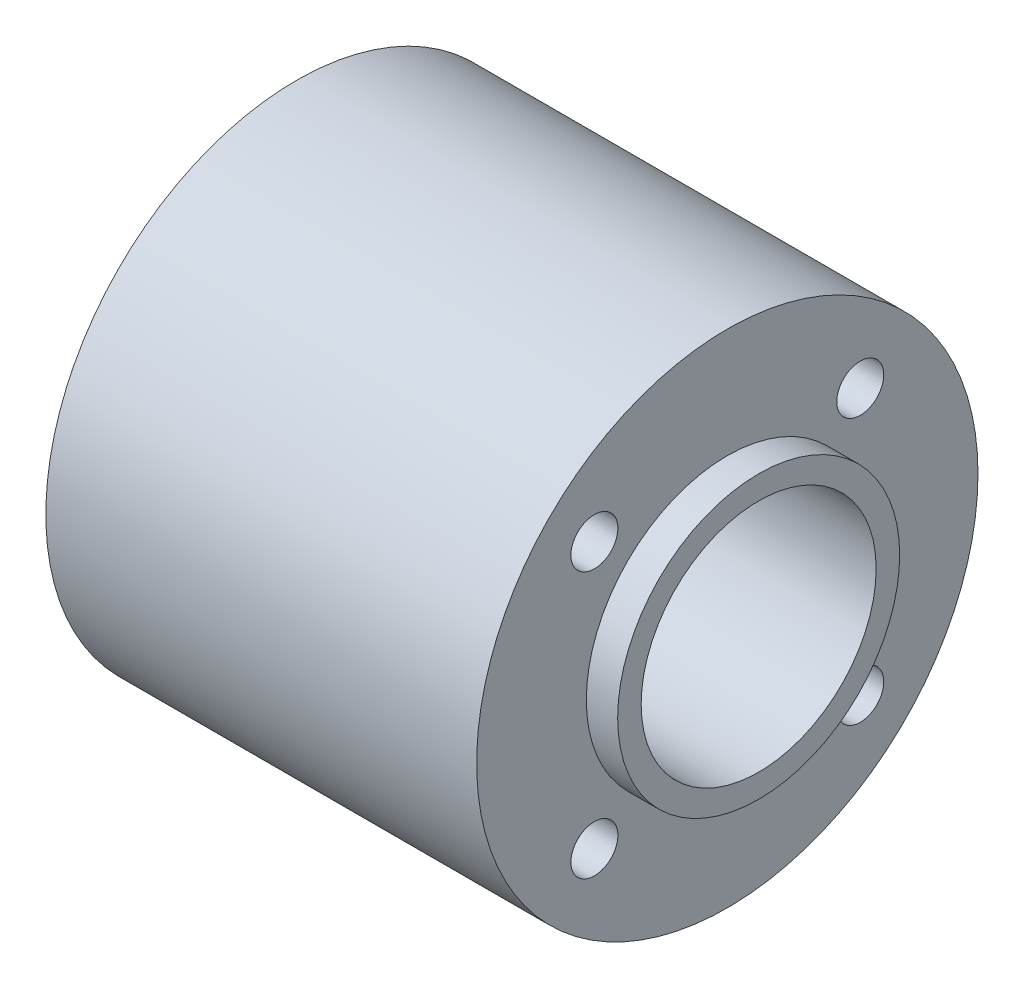
ISO-10303-21;
HEADER;
FILE_DESCRIPTION(('STEP AP214'),'2;1');
FILE_NAME('part.step','',(''),(''),'','','');
FILE_SCHEMA(('AUTOMOTIVE_DESIGN { 1 0 10303 214 1 1 1 1 }'));
ENDSEC;
DATA;
#1=APPLICATION_CONTEXT('core data for automotive mechanical design processes');
#2=APPLICATION_PROTOCOL_DEFINITION('international standard','automotive_design',2000,#1);
#3=PRODUCT_CONTEXT('',#1,'mechanical');
#4=PRODUCT('Part','Part','',(#3));
#5=PRODUCT_RELATED_PRODUCT_CATEGORY('part','',(#4));
#6=PRODUCT_DEFINITION_FORMATION('','',#4);
#7=PRODUCT_DEFINITION_CONTEXT('part definition',#1,'design');
#8=PRODUCT_DEFINITION('design','',#6,#7);
#9=PRODUCT_DEFINITION_SHAPE('','',#8);
#10=(LENGTH_UNIT() NAMED_UNIT(*) SI_UNIT(.MILLI.,.METRE.));
#11=(NAMED_UNIT(*) PLANE_ANGLE_UNIT() SI_UNIT($,.RADIAN.));
#12=(NAMED_UNIT(*) SI_UNIT($,.STERADIAN.) SOLID_ANGLE_UNIT());
#13=UNCERTAINTY_MEASURE_WITH_UNIT(LENGTH_MEASURE(1.E-05),#10,'distance_accuracy_value','');
#14=(GEOMETRIC_REPRESENTATION_CONTEXT(3) GLOBAL_UNCERTAINTY_ASSIGNED_CONTEXT((#13)) GLOBAL_UNIT_ASSIGNED_CONTEXT((#10,
#11,#12)) REPRESENTATION_CONTEXT('',''));
#15=CARTESIAN_POINT('',(0.,0.,0.));
#16=DIRECTION('',(0.,0.,1.));
#17=DIRECTION('',(1.,0.,0.));
#18=AXIS2_PLACEMENT_3D('',#15,#16,#17);
#19=CARTESIAN_POINT('',(13.75,0.,0.));
#20=DIRECTION('',(1.,0.,0.));
#21=DIRECTION('',(0.,0.,-1.));
#22=AXIS2_PLACEMENT_3D('',#19,#20,#21);
#23=PLANE('',#22);
#24=CARTESIAN_POINT('',(13.75,0.,0.));
#25=DIRECTION('',(1.,0.,0.));
#26=DIRECTION('',(0.,0.,-1.));
#27=AXIS2_PLACEMENT_3D('',#24,#25,#26);
#28=CIRCLE('',#27,9.);
#29=CARTESIAN_POINT('',(13.75,0.,-9.));
#30=VERTEX_POINT('',#29);
#31=EDGE_CURVE('E77',#30,#30,#28,.T.);
#32=ORIENTED_EDGE('',*,*,#31,.F.);
#33=EDGE_LOOP('',(#32));
#34=FACE_BOUND('',#33,.T.);
#35=CARTESIAN_POINT('',(13.75,-8.48528137423807,-8.48528137423906));
#36=DIRECTION('',(1.,0.,0.));
#37=DIRECTION('',(0.,0.,-1.));
#38=AXIS2_PLACEMENT_3D('',#35,#36,#37);
#39=CIRCLE('',#38,1.50000000000067);
#40=CARTESIAN_POINT('',(13.75,-8.48528137423807,-9.98528137423973));
#41=VERTEX_POINT('',#40);
#42=EDGE_CURVE('E62',#41,#41,#39,.T.);
#43=ORIENTED_EDGE('',*,*,#42,.F.);
#44=EDGE_LOOP('',(#43));
#45=FACE_BOUND('',#44,.T.);
#46=CARTESIAN_POINT('',(13.75,8.48528137423855,8.48528137423859));
#47=DIRECTION('',(1.,0.,0.));
#48=DIRECTION('',(0.,0.,-1.));
#49=AXIS2_PLACEMENT_3D('',#46,#47,#48);
#50=CIRCLE('',#49,1.5);
#51=CARTESIAN_POINT('',(13.75,8.48528137423855,6.98528137423859));
#52=VERTEX_POINT('',#51);
#53=EDGE_CURVE('E51',#52,#52,#50,.T.);
#54=ORIENTED_EDGE('',*,*,#53,.F.);
#55=EDGE_LOOP('',(#54));
#56=FACE_BOUND('',#55,.T.);
#57=CARTESIAN_POINT('',(13.75,0.,0.));
#58=DIRECTION('',(1.,0.,0.));
#59=DIRECTION('',(0.,0.,-1.));
#60=AXIS2_PLACEMENT_3D('',#57,#58,#59);
#61=CIRCLE('',#60,16.);
#62=CARTESIAN_POINT('',(13.75,0.,-16.));
#63=VERTEX_POINT('',#62);
#64=EDGE_CURVE('E10',#63,#63,#61,.T.);
#65=ORIENTED_EDGE('',*,*,#64,.T.);
#66=EDGE_LOOP('',(#65));
#67=FACE_BOUND('',#66,.T.);
#68=CARTESIAN_POINT('',(13.75,8.48528137423906,-8.48528137423855));
#69=DIRECTION('',(1.,0.,0.));
#70=DIRECTION('',(0.,0.,-1.));
#71=AXIS2_PLACEMENT_3D('',#68,#69,#70);
#72=CIRCLE('',#71,1.50000000000049);
#73=CARTESIAN_POINT('',(13.75,8.48528137423906,-9.98528137423904));
#74=VERTEX_POINT('',#73);
#75=EDGE_CURVE('E56',#74,#74,#72,.T.);
#76=ORIENTED_EDGE('',*,*,#75,.F.);
#77=EDGE_LOOP('',(#76));
#78=FACE_BOUND('',#77,.T.);
#79=CARTESIAN_POINT('',(13.75,-8.48528137423859,8.48528137423808));
#80=DIRECTION('',(1.,0.,0.));
#81=DIRECTION('',(0.,0.,-1.));
#82=AXIS2_PLACEMENT_3D('',#79,#80,#81);
#83=CIRCLE('',#82,1.50000000000025);
#84=CARTESIAN_POINT('',(13.75,-8.48528137423859,6.98528137423783));
#85=VERTEX_POINT('',#84);
#86=EDGE_CURVE('E68',#85,#85,#83,.T.);
#87=ORIENTED_EDGE('',*,*,#86,.F.);
#88=EDGE_LOOP('',(#87));
#89=FACE_BOUND('',#88,.T.);
#90=ADVANCED_FACE('F40',(#34,#45,#56,#67,#78,#89),#23,.T.);
#91=CARTESIAN_POINT('',(-13.75,0.,0.));
#92=DIRECTION('',(1.,0.,0.));
#93=DIRECTION('',(0.,0.,-1.));
#94=AXIS2_PLACEMENT_3D('',#91,#92,#93);
#95=PLANE('',#94);
#96=CARTESIAN_POINT('',(-13.75,0.,0.));
#97=DIRECTION('',(1.,0.,0.));
#98=DIRECTION('',(0.,0.,-1.));
#99=AXIS2_PLACEMENT_3D('',#96,#97,#98);
#100=CIRCLE('',#99,9.);
#101=CARTESIAN_POINT('',(-13.75,0.,-9.));
#102=VERTEX_POINT('',#101);
#103=EDGE_CURVE('E86',#102,#102,#100,.T.);
#104=ORIENTED_EDGE('',*,*,#103,.T.);
#105=EDGE_LOOP('',(#104));
#106=FACE_BOUND('',#105,.T.);
#107=CARTESIAN_POINT('',(-13.75,0.,0.));
#108=DIRECTION('',(1.,0.,0.));
#109=DIRECTION('',(0.,0.,-1.));
#110=AXIS2_PLACEMENT_3D('',#107,#108,#109);
#111=CIRCLE('',#110,16.);
#112=CARTESIAN_POINT('',(-13.75,0.,-16.));
#113=VERTEX_POINT('',#112);
#114=EDGE_CURVE('E44',#113,#113,#111,.T.);
#115=ORIENTED_EDGE('',*,*,#114,.F.);
#116=EDGE_LOOP('',(#115));
#117=FACE_BOUND('',#116,.T.);
#118=CARTESIAN_POINT('',(-13.75,8.48528137423855,8.48528137423859));
#119=DIRECTION('',(1.,0.,0.));
#120=DIRECTION('',(0.,0.,-1.));
#121=AXIS2_PLACEMENT_3D('',#118,#119,#120);
#122=CIRCLE('',#121,1.5);
#123=CARTESIAN_POINT('',(-13.75,8.48528137423855,6.98528137423859));
#124=VERTEX_POINT('',#123);
#125=EDGE_CURVE('E53',#124,#124,#122,.T.);
#126=ORIENTED_EDGE('',*,*,#125,.T.);
#127=EDGE_LOOP('',(#126));
#128=FACE_BOUND('',#127,.T.);
#129=CARTESIAN_POINT('',(-13.75,8.48528137423906,-8.48528137423855));
#130=DIRECTION('',(1.,0.,0.));
#131=DIRECTION('',(0.,0.,-1.));
#132=AXIS2_PLACEMENT_3D('',#129,#130,#131);
#133=CIRCLE('',#132,1.50000000000049);
#134=CARTESIAN_POINT('',(-13.75,8.48528137423906,-9.98528137423904));
#135=VERTEX_POINT('',#134);
#136=EDGE_CURVE('E59',#135,#135,#133,.T.);
#137=ORIENTED_EDGE('',*,*,#136,.T.);
#138=EDGE_LOOP('',(#137));
#139=FACE_BOUND('',#138,.T.);
#140=CARTESIAN_POINT('',(-13.75,-8.48528137423807,-8.48528137423906));
#141=DIRECTION('',(1.,0.,0.));
#142=DIRECTION('',(0.,0.,-1.));
#143=AXIS2_PLACEMENT_3D('',#140,#141,#142);
#144=CIRCLE('',#143,1.50000000000067);
#145=CARTESIAN_POINT('',(-13.75,-8.48528137423807,-9.98528137423973));
#146=VERTEX_POINT('',#145);
#147=EDGE_CURVE('E65',#146,#146,#144,.T.);
#148=ORIENTED_EDGE('',*,*,#147,.T.);
#149=EDGE_LOOP('',(#148));
#150=FACE_BOUND('',#149,.T.);
#151=CARTESIAN_POINT('',(-13.75,-8.48528137423859,8.48528137423808));
#152=DIRECTION('',(1.,0.,0.));
#153=DIRECTION('',(0.,0.,-1.));
#154=AXIS2_PLACEMENT_3D('',#151,#152,#153);
#155=CIRCLE('',#154,1.50000000000025);
#156=CARTESIAN_POINT('',(-13.75,-8.48528137423859,6.98528137423783));
#157=VERTEX_POINT('',#156);
#158=EDGE_CURVE('E71',#157,#157,#155,.T.);
#159=ORIENTED_EDGE('',*,*,#158,.T.);
#160=EDGE_LOOP('',(#159));
#161=FACE_BOUND('',#160,.T.);
#162=ADVANCED_FACE('F110',(#106,#117,#128,#139,#150,#161),#95,.F.);
#163=CARTESIAN_POINT('',(13.75,0.,0.));
#164=DIRECTION('',(-1.,0.,0.));
#165=DIRECTION('',(0.,0.,1.));
#166=AXIS2_PLACEMENT_3D('',#163,#164,#165);
#167=CYLINDRICAL_SURFACE('',#166,16.);
#168=ORIENTED_EDGE('',*,*,#64,.F.);
#169=EDGE_LOOP('',(#168));
#170=FACE_BOUND('',#169,.T.);
#171=ORIENTED_EDGE('',*,*,#114,.T.);
#172=EDGE_LOOP('',(#171));
#173=FACE_BOUND('',#172,.T.);
#174=ADVANCED_FACE('F42',(#170,#173),#167,.T.);
#175=CARTESIAN_POINT('',(13.75,0.,0.));
#176=DIRECTION('',(-1.,0.,0.));
#177=DIRECTION('',(0.,0.,1.));
#178=AXIS2_PLACEMENT_3D('',#175,#176,#177);
#179=CYLINDRICAL_SURFACE('',#178,7.5);
#180=CARTESIAN_POINT('',(15.75,0.,0.));
#181=DIRECTION('',(1.,0.,0.));
#182=DIRECTION('',(0.,0.,-1.));
#183=AXIS2_PLACEMENT_3D('',#180,#181,#182);
#184=CIRCLE('',#183,7.5);
#185=CARTESIAN_POINT('',(15.75,0.,-7.5));
#186=VERTEX_POINT('',#185);
#187=EDGE_CURVE('E80',#186,#186,#184,.F.);
#188=ORIENTED_EDGE('',*,*,#187,.F.);
#189=EDGE_LOOP('',(#188));
#190=FACE_BOUND('',#189,.T.);
#191=CARTESIAN_POINT('',(-15.75,0.,0.));
#192=DIRECTION('',(1.,0.,0.));
#193=DIRECTION('',(0.,0.,-1.));
#194=AXIS2_PLACEMENT_3D('',#191,#192,#193);
#195=CIRCLE('',#194,7.5);
#196=CARTESIAN_POINT('',(-15.75,0.,-7.5));
#197=VERTEX_POINT('',#196);
#198=EDGE_CURVE('E89',#197,#197,#195,.F.);
#199=ORIENTED_EDGE('',*,*,#198,.T.);
#200=EDGE_LOOP('',(#199));
#201=FACE_BOUND('',#200,.T.);
#202=ADVANCED_FACE('F95',(#190,#201),#179,.F.);
#203=CARTESIAN_POINT('',(13.75,8.48528137423855,8.48528137423859));
#204=DIRECTION('',(-1.,0.,0.));
#205=DIRECTION('',(0.,0.,1.));
#206=AXIS2_PLACEMENT_3D('',#203,#204,#205);
#207=CYLINDRICAL_SURFACE('',#206,1.5);
#208=ORIENTED_EDGE('',*,*,#53,.T.);
#209=EDGE_LOOP('',(#208));
#210=FACE_BOUND('',#209,.T.);
#211=ORIENTED_EDGE('',*,*,#125,.F.);
#212=EDGE_LOOP('',(#211));
#213=FACE_BOUND('',#212,.T.);
#214=ADVANCED_FACE('F148',(#210,#213),#207,.F.);
#215=CARTESIAN_POINT('',(13.75,8.48528137423906,-8.48528137423855));
#216=DIRECTION('',(-1.,0.,0.));
#217=DIRECTION('',(0.,0.,1.));
#218=AXIS2_PLACEMENT_3D('',#215,#216,#217);
#219=CYLINDRICAL_SURFACE('',#218,1.50000000000049);
#220=ORIENTED_EDGE('',*,*,#75,.T.);
#221=EDGE_LOOP('',(#220));
#222=FACE_BOUND('',#221,.T.);
#223=ORIENTED_EDGE('',*,*,#136,.F.);
#224=EDGE_LOOP('',(#223));
#225=FACE_BOUND('',#224,.T.);
#226=ADVANCED_FACE('F135',(#222,#225),#219,.F.);
#227=CARTESIAN_POINT('',(13.75,-8.48528137423807,-8.48528137423906));
#228=DIRECTION('',(-1.,0.,0.));
#229=DIRECTION('',(0.,0.,1.));
#230=AXIS2_PLACEMENT_3D('',#227,#228,#229);
#231=CYLINDRICAL_SURFACE('',#230,1.50000000000067);
#232=ORIENTED_EDGE('',*,*,#42,.T.);
#233=EDGE_LOOP('',(#232));
#234=FACE_BOUND('',#233,.T.);
#235=ORIENTED_EDGE('',*,*,#147,.F.);
#236=EDGE_LOOP('',(#235));
#237=FACE_BOUND('',#236,.T.);
#238=ADVANCED_FACE('F126',(#234,#237),#231,.F.);
#239=CARTESIAN_POINT('',(13.75,-8.48528137423859,8.48528137423808));
#240=DIRECTION('',(-1.,0.,0.));
#241=DIRECTION('',(0.,0.,1.));
#242=AXIS2_PLACEMENT_3D('',#239,#240,#241);
#243=CYLINDRICAL_SURFACE('',#242,1.50000000000025);
#244=ORIENTED_EDGE('',*,*,#86,.T.);
#245=EDGE_LOOP('',(#244));
#246=FACE_BOUND('',#245,.T.);
#247=ORIENTED_EDGE('',*,*,#158,.F.);
#248=EDGE_LOOP('',(#247));
#249=FACE_BOUND('',#248,.T.);
#250=ADVANCED_FACE('F123',(#246,#249),#243,.F.);
#251=CARTESIAN_POINT('',(15.75,0.,0.));
#252=DIRECTION('',(-1.,0.,0.));
#253=DIRECTION('',(0.,0.,1.));
#254=AXIS2_PLACEMENT_3D('',#251,#252,#253);
#255=CYLINDRICAL_SURFACE('',#254,9.);
#256=CARTESIAN_POINT('',(15.75,0.,0.));
#257=DIRECTION('',(1.,0.,0.));
#258=DIRECTION('',(0.,0.,-1.));
#259=AXIS2_PLACEMENT_3D('',#256,#257,#258);
#260=CIRCLE('',#259,9.);
#261=CARTESIAN_POINT('',(15.75,0.,-9.));
#262=VERTEX_POINT('',#261);
#263=EDGE_CURVE('E74',#262,#262,#260,.T.);
#264=ORIENTED_EDGE('',*,*,#263,.F.);
#265=EDGE_LOOP('',(#264));
#266=FACE_BOUND('',#265,.T.);
#267=ORIENTED_EDGE('',*,*,#31,.T.);
#268=EDGE_LOOP('',(#267));
#269=FACE_BOUND('',#268,.T.);
#270=ADVANCED_FACE('F125',(#266,#269),#255,.T.);
#271=CARTESIAN_POINT('',(15.75,0.,0.));
#272=DIRECTION('',(1.,0.,0.));
#273=DIRECTION('',(0.,0.,-1.));
#274=AXIS2_PLACEMENT_3D('',#271,#272,#273);
#275=PLANE('',#274);
#276=ORIENTED_EDGE('',*,*,#187,.T.);
#277=EDGE_LOOP('',(#276));
#278=FACE_BOUND('',#277,.T.);
#279=ORIENTED_EDGE('',*,*,#263,.T.);
#280=EDGE_LOOP('',(#279));
#281=FACE_BOUND('',#280,.T.);
#282=ADVANCED_FACE('F106',(#278,#281),#275,.T.);
#283=CARTESIAN_POINT('',(-15.75,0.,0.));
#284=DIRECTION('',(1.,0.,0.));
#285=DIRECTION('',(0.,0.,-1.));
#286=AXIS2_PLACEMENT_3D('',#283,#284,#285);
#287=CYLINDRICAL_SURFACE('',#286,9.);
#288=CARTESIAN_POINT('',(-15.75,0.,0.));
#289=DIRECTION('',(1.,0.,0.));
#290=DIRECTION('',(0.,0.,-1.));
#291=AXIS2_PLACEMENT_3D('',#288,#289,#290);
#292=CIRCLE('',#291,9.);
#293=CARTESIAN_POINT('',(-15.75,0.,-9.));
#294=VERTEX_POINT('',#293);
#295=EDGE_CURVE('E81',#294,#294,#292,.T.);
#296=ORIENTED_EDGE('',*,*,#295,.T.);
#297=EDGE_LOOP('',(#296));
#298=FACE_BOUND('',#297,.T.);
#299=ORIENTED_EDGE('',*,*,#103,.F.);
#300=EDGE_LOOP('',(#299));
#301=FACE_BOUND('',#300,.T.);
#302=ADVANCED_FACE('F100',(#298,#301),#287,.T.);
#303=CARTESIAN_POINT('',(-15.75,0.,0.));
#304=DIRECTION('',(-1.,0.,0.));
#305=DIRECTION('',(0.,0.,-1.));
#306=AXIS2_PLACEMENT_3D('',#303,#304,#305);
#307=PLANE('',#306);
#308=ORIENTED_EDGE('',*,*,#198,.F.);
#309=EDGE_LOOP('',(#308));
#310=FACE_BOUND('',#309,.T.);
#311=ORIENTED_EDGE('',*,*,#295,.F.);
#312=EDGE_LOOP('',(#311));
#313=FACE_BOUND('',#312,.T.);
#314=ADVANCED_FACE('F97',(#310,#313),#307,.T.);
#315=CLOSED_SHELL('',(#90,#162,#174,#202,#214,#226,#238,#250,#270,#282,#302,#314));
#316=MANIFOLD_SOLID_BREP('B2',#315);
#317=ADVANCED_BREP_SHAPE_REPRESENTATION('',(#18,#316),#14);
#318=SHAPE_DEFINITION_REPRESENTATION(#9,#317);
ENDSEC;
END-ISO-10303-21;
